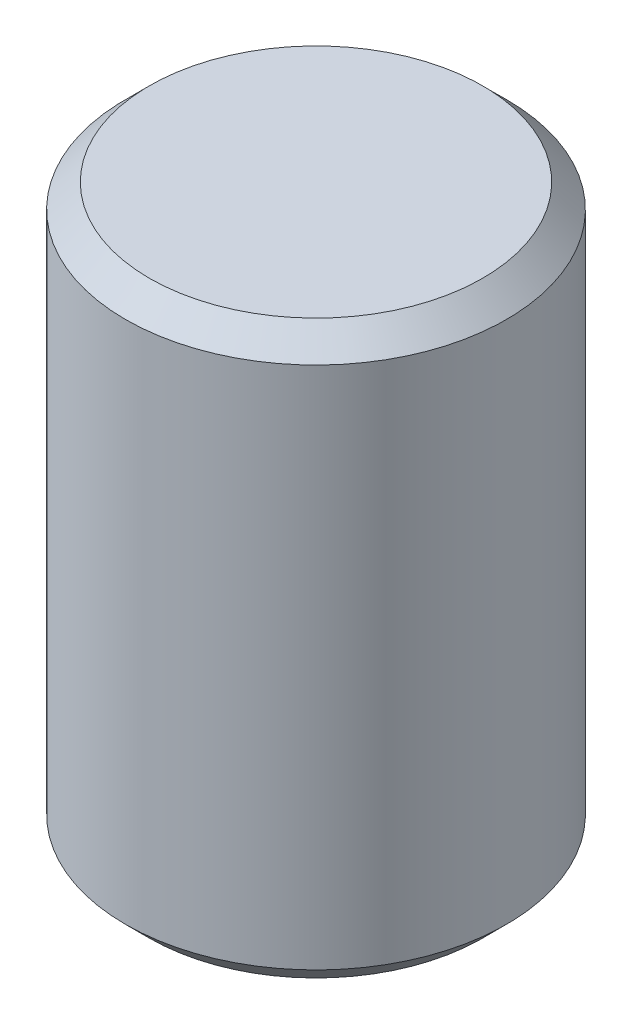
ISO-10303-21;
HEADER;
FILE_DESCRIPTION(('STEP AP214'),'2;1');
FILE_NAME('part.step','',(''),(''),'','','');
FILE_SCHEMA(('AUTOMOTIVE_DESIGN { 1 0 10303 214 1 1 1 1 }'));
ENDSEC;
DATA;
#1=APPLICATION_CONTEXT('core data for automotive mechanical design processes');
#2=APPLICATION_PROTOCOL_DEFINITION('international standard','automotive_design',2000,#1);
#3=PRODUCT_CONTEXT('',#1,'mechanical');
#4=PRODUCT('Part','Part','',(#3));
#5=PRODUCT_RELATED_PRODUCT_CATEGORY('part','',(#4));
#6=PRODUCT_DEFINITION_FORMATION('','',#4);
#7=PRODUCT_DEFINITION_CONTEXT('part definition',#1,'design');
#8=PRODUCT_DEFINITION('design','',#6,#7);
#9=PRODUCT_DEFINITION_SHAPE('','',#8);
#10=(LENGTH_UNIT() NAMED_UNIT(*) SI_UNIT(.MILLI.,.METRE.));
#11=(NAMED_UNIT(*) PLANE_ANGLE_UNIT() SI_UNIT($,.RADIAN.));
#12=(NAMED_UNIT(*) SI_UNIT($,.STERADIAN.) SOLID_ANGLE_UNIT());
#13=UNCERTAINTY_MEASURE_WITH_UNIT(LENGTH_MEASURE(1.E-05),#10,'distance_accuracy_value','');
#14=(GEOMETRIC_REPRESENTATION_CONTEXT(3) GLOBAL_UNCERTAINTY_ASSIGNED_CONTEXT((#13)) GLOBAL_UNIT_ASSIGNED_CONTEXT((#10,
#11,#12)) REPRESENTATION_CONTEXT('',''));
#15=CARTESIAN_POINT('',(0.,0.,0.));
#16=DIRECTION('',(0.,0.,1.));
#17=DIRECTION('',(1.,0.,0.));
#18=AXIS2_PLACEMENT_3D('',#15,#16,#17);
#19=CARTESIAN_POINT('',(0.,12.,0.));
#20=DIRECTION('',(0.,-1.,0.));
#21=DIRECTION('',(0.,0.,-1.));
#22=AXIS2_PLACEMENT_3D('',#19,#20,#21);
#23=CYLINDRICAL_SURFACE('',#22,4.);
#24=CARTESIAN_POINT('',(0.,0.499999999999999,0.));
#25=DIRECTION('',(0.,1.,0.));
#26=DIRECTION('',(0.,0.,1.));
#27=AXIS2_PLACEMENT_3D('',#24,#25,#26);
#28=CIRCLE('',#27,4.);
#29=CARTESIAN_POINT('',(0.,0.499999999999999,4.));
#30=VERTEX_POINT('',#29);
#31=EDGE_CURVE('E53',#30,#30,#28,.T.);
#32=ORIENTED_EDGE('',*,*,#31,.T.);
#33=EDGE_LOOP('',(#32));
#34=FACE_BOUND('',#33,.T.);
#35=CARTESIAN_POINT('',(0.,11.5,0.));
#36=DIRECTION('',(0.,1.,0.));
#37=DIRECTION('',(0.,0.,1.));
#38=AXIS2_PLACEMENT_3D('',#35,#36,#37);
#39=CIRCLE('',#38,4.);
#40=CARTESIAN_POINT('',(0.,11.5,4.));
#41=VERTEX_POINT('',#40);
#42=EDGE_CURVE('E58',#41,#41,#39,.F.);
#43=ORIENTED_EDGE('',*,*,#42,.T.);
#44=EDGE_LOOP('',(#43));
#45=FACE_BOUND('',#44,.T.);
#46=ADVANCED_FACE('F39',(#34,#45),#23,.T.);
#47=CARTESIAN_POINT('',(0.,12.,0.));
#48=DIRECTION('',(0.,1.,0.));
#49=DIRECTION('',(0.,0.,1.));
#50=AXIS2_PLACEMENT_3D('',#47,#48,#49);
#51=PLANE('',#50);
#52=CARTESIAN_POINT('',(0.,12.,0.));
#53=DIRECTION('',(0.,1.,0.));
#54=DIRECTION('',(0.,0.,1.));
#55=AXIS2_PLACEMENT_3D('',#52,#53,#54);
#56=CIRCLE('',#55,3.5);
#57=CARTESIAN_POINT('',(0.,12.,3.5));
#58=VERTEX_POINT('',#57);
#59=EDGE_CURVE('E10',#58,#58,#56,.T.);
#60=ORIENTED_EDGE('',*,*,#59,.T.);
#61=EDGE_LOOP('',(#60));
#62=FACE_BOUND('',#61,.T.);
#63=ADVANCED_FACE('F75',(#62),#51,.T.);
#64=CARTESIAN_POINT('',(0.,0.,0.));
#65=DIRECTION('',(0.,1.,0.));
#66=DIRECTION('',(0.,0.,1.));
#67=AXIS2_PLACEMENT_3D('',#64,#65,#66);
#68=PLANE('',#67);
#69=CARTESIAN_POINT('',(0.,0.,0.));
#70=DIRECTION('',(0.,1.,0.));
#71=DIRECTION('',(0.,0.,1.));
#72=AXIS2_PLACEMENT_3D('',#69,#70,#71);
#73=CIRCLE('',#72,3.5);
#74=CARTESIAN_POINT('',(0.,0.,3.5));
#75=VERTEX_POINT('',#74);
#76=EDGE_CURVE('E48',#75,#75,#73,.F.);
#77=ORIENTED_EDGE('',*,*,#76,.T.);
#78=EDGE_LOOP('',(#77));
#79=FACE_BOUND('',#78,.T.);
#80=ADVANCED_FACE('F72',(#79),#68,.F.);
#81=CARTESIAN_POINT('',(0.,0.499999999999999,0.));
#82=DIRECTION('',(0.,1.,0.));
#83=DIRECTION('',(0.,0.,1.));
#84=AXIS2_PLACEMENT_3D('',#81,#82,#83);
#85=CONICAL_SURFACE('',#84,4.,0.78539816339745);
#86=ORIENTED_EDGE('',*,*,#76,.F.);
#87=EDGE_LOOP('',(#86));
#88=FACE_BOUND('',#87,.T.);
#89=ORIENTED_EDGE('',*,*,#31,.F.);
#90=EDGE_LOOP('',(#89));
#91=FACE_BOUND('',#90,.T.);
#92=ADVANCED_FACE('F68',(#88,#91),#85,.T.);
#93=CARTESIAN_POINT('',(0.,12.,0.));
#94=DIRECTION('',(0.,-1.,0.));
#95=DIRECTION('',(0.,0.,-1.));
#96=AXIS2_PLACEMENT_3D('',#93,#94,#95);
#97=CONICAL_SURFACE('',#96,3.5,0.785398163397448);
#98=ORIENTED_EDGE('',*,*,#42,.F.);
#99=EDGE_LOOP('',(#98));
#100=FACE_BOUND('',#99,.T.);
#101=ORIENTED_EDGE('',*,*,#59,.F.);
#102=EDGE_LOOP('',(#101));
#103=FACE_BOUND('',#102,.T.);
#104=ADVANCED_FACE('F42',(#100,#103),#97,.T.);
#105=CLOSED_SHELL('',(#46,#63,#80,#92,#104));
#106=MANIFOLD_SOLID_BREP('B2',#105);
#107=ADVANCED_BREP_SHAPE_REPRESENTATION('',(#18,#106),#14);
#108=SHAPE_DEFINITION_REPRESENTATION(#9,#107);
ENDSEC;
END-ISO-10303-21;
